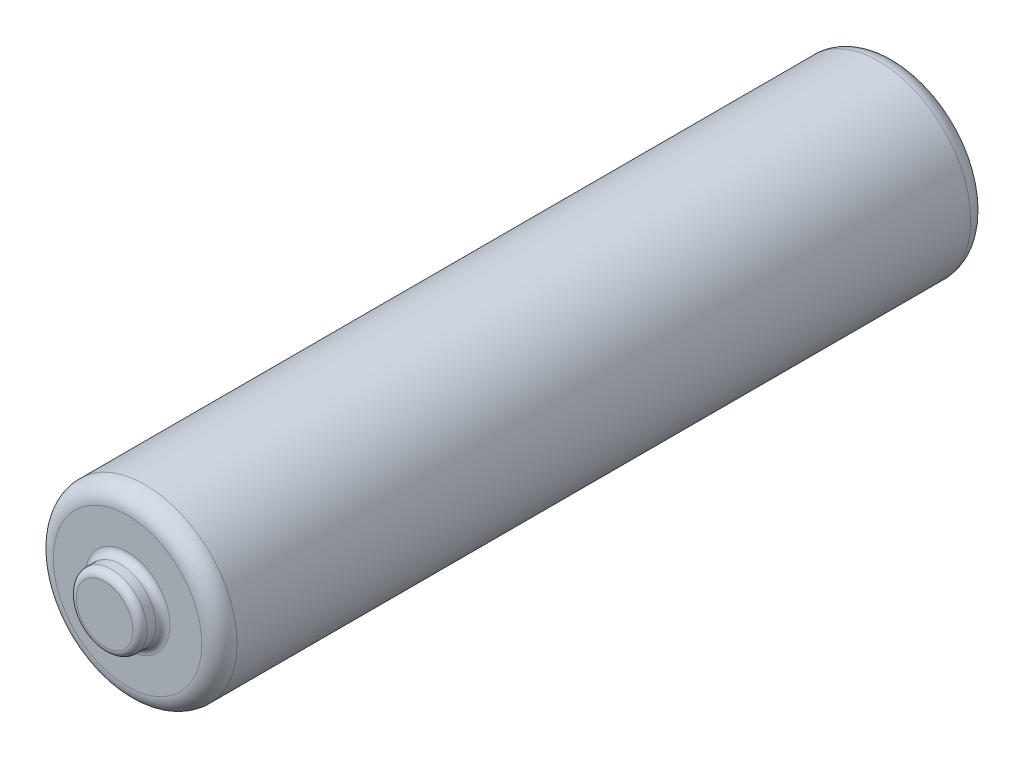
ISO-10303-21;
HEADER;
FILE_DESCRIPTION(('STEP AP214'),'2;1');
FILE_NAME('part.step','',(''),(''),'','','');
FILE_SCHEMA(('AUTOMOTIVE_DESIGN { 1 0 10303 214 1 1 1 1 }'));
ENDSEC;
DATA;
#1=APPLICATION_CONTEXT('core data for automotive mechanical design processes');
#2=APPLICATION_PROTOCOL_DEFINITION('international standard','automotive_design',2000,#1);
#3=PRODUCT_CONTEXT('',#1,'mechanical');
#4=PRODUCT('Part','Part','',(#3));
#5=PRODUCT_RELATED_PRODUCT_CATEGORY('part','',(#4));
#6=PRODUCT_DEFINITION_FORMATION('','',#4);
#7=PRODUCT_DEFINITION_CONTEXT('part definition',#1,'design');
#8=PRODUCT_DEFINITION('design','',#6,#7);
#9=PRODUCT_DEFINITION_SHAPE('','',#8);
#10=(LENGTH_UNIT() NAMED_UNIT(*) SI_UNIT(.MILLI.,.METRE.));
#11=(NAMED_UNIT(*) PLANE_ANGLE_UNIT() SI_UNIT($,.RADIAN.));
#12=(NAMED_UNIT(*) SI_UNIT($,.STERADIAN.) SOLID_ANGLE_UNIT());
#13=UNCERTAINTY_MEASURE_WITH_UNIT(LENGTH_MEASURE(1.E-05),#10,'distance_accuracy_value','');
#14=(GEOMETRIC_REPRESENTATION_CONTEXT(3) GLOBAL_UNCERTAINTY_ASSIGNED_CONTEXT((#13)) GLOBAL_UNIT_ASSIGNED_CONTEXT((#10,
#11,#12)) REPRESENTATION_CONTEXT('',''));
#15=CARTESIAN_POINT('',(0.,0.,0.));
#16=DIRECTION('',(0.,0.,1.));
#17=DIRECTION('',(1.,0.,0.));
#18=AXIS2_PLACEMENT_3D('',#15,#16,#17);
#19=CARTESIAN_POINT('',(0.,0.,43.5));
#20=DIRECTION('',(0.,0.,1.));
#21=DIRECTION('',(1.,0.,0.));
#22=AXIS2_PLACEMENT_3D('',#19,#20,#21);
#23=PLANE('',#22);
#24=CARTESIAN_POINT('',(0.,0.,43.5));
#25=DIRECTION('',(0.,0.,1.));
#26=DIRECTION('',(1.,0.,0.));
#27=AXIS2_PLACEMENT_3D('',#24,#25,#26);
#28=CIRCLE('',#27,2.4);
#29=CARTESIAN_POINT('',(2.4,0.,43.5));
#30=VERTEX_POINT('',#29);
#31=EDGE_CURVE('E10',#30,#30,#28,.F.);
#32=ORIENTED_EDGE('',*,*,#31,.T.);
#33=EDGE_LOOP('',(#32));
#34=FACE_BOUND('',#33,.T.);
#35=CARTESIAN_POINT('',(0.,0.,43.5));
#36=DIRECTION('',(0.,0.,1.));
#37=DIRECTION('',(1.,0.,0.));
#38=AXIS2_PLACEMENT_3D('',#35,#36,#37);
#39=CIRCLE('',#38,4.2);
#40=CARTESIAN_POINT('',(4.2,0.,43.5));
#41=VERTEX_POINT('',#40);
#42=EDGE_CURVE('E52',#41,#41,#39,.T.);
#43=ORIENTED_EDGE('',*,*,#42,.T.);
#44=EDGE_LOOP('',(#43));
#45=FACE_BOUND('',#44,.T.);
#46=ADVANCED_FACE('F32',(#34,#45),#23,.T.);
#47=CARTESIAN_POINT('',(0.,0.,43.5));
#48=DIRECTION('',(0.,0.,-1.));
#49=DIRECTION('',(-1.,0.,0.));
#50=AXIS2_PLACEMENT_3D('',#47,#48,#49);
#51=CYLINDRICAL_SURFACE('',#50,5.2);
#52=CARTESIAN_POINT('',(0.,0.,1.));
#53=DIRECTION('',(0.,0.,1.));
#54=DIRECTION('',(1.,0.,0.));
#55=AXIS2_PLACEMENT_3D('',#52,#53,#54);
#56=CIRCLE('',#55,5.2);
#57=CARTESIAN_POINT('',(5.2,0.,1.));
#58=VERTEX_POINT('',#57);
#59=EDGE_CURVE('E58',#58,#58,#56,.T.);
#60=ORIENTED_EDGE('',*,*,#59,.T.);
#61=EDGE_LOOP('',(#60));
#62=FACE_BOUND('',#61,.T.);
#63=CARTESIAN_POINT('',(0.,0.,42.5));
#64=DIRECTION('',(0.,0.,1.));
#65=DIRECTION('',(1.,0.,0.));
#66=AXIS2_PLACEMENT_3D('',#63,#64,#65);
#67=CIRCLE('',#66,5.2);
#68=CARTESIAN_POINT('',(5.2,0.,42.5));
#69=VERTEX_POINT('',#68);
#70=EDGE_CURVE('E61',#69,#69,#67,.F.);
#71=ORIENTED_EDGE('',*,*,#70,.T.);
#72=EDGE_LOOP('',(#71));
#73=FACE_BOUND('',#72,.T.);
#74=ADVANCED_FACE('F65',(#62,#73),#51,.T.);
#75=CARTESIAN_POINT('',(0.,0.,0.));
#76=DIRECTION('',(0.,0.,1.));
#77=DIRECTION('',(1.,0.,0.));
#78=AXIS2_PLACEMENT_3D('',#75,#76,#77);
#79=PLANE('',#78);
#80=CARTESIAN_POINT('',(0.,0.,0.));
#81=DIRECTION('',(0.,0.,1.));
#82=DIRECTION('',(1.,0.,0.));
#83=AXIS2_PLACEMENT_3D('',#80,#81,#82);
#84=CIRCLE('',#83,4.2);
#85=CARTESIAN_POINT('',(4.2,0.,0.));
#86=VERTEX_POINT('',#85);
#87=EDGE_CURVE('E55',#86,#86,#84,.F.);
#88=ORIENTED_EDGE('',*,*,#87,.T.);
#89=EDGE_LOOP('',(#88));
#90=FACE_BOUND('',#89,.T.);
#91=ADVANCED_FACE('F80',(#90),#79,.F.);
#92=CARTESIAN_POINT('',(0.,0.,44.8));
#93=DIRECTION('',(0.,0.,-1.));
#94=DIRECTION('',(-1.,0.,0.));
#95=AXIS2_PLACEMENT_3D('',#92,#93,#94);
#96=CYLINDRICAL_SURFACE('',#95,2.);
#97=CARTESIAN_POINT('',(0.,0.,44.4));
#98=DIRECTION('',(0.,0.,1.));
#99=DIRECTION('',(1.,0.,0.));
#100=AXIS2_PLACEMENT_3D('',#97,#98,#99);
#101=CIRCLE('',#100,2.);
#102=CARTESIAN_POINT('',(2.,0.,44.4));
#103=VERTEX_POINT('',#102);
#104=EDGE_CURVE('E39',#103,#103,#101,.F.);
#105=ORIENTED_EDGE('',*,*,#104,.T.);
#106=EDGE_LOOP('',(#105));
#107=FACE_BOUND('',#106,.T.);
#108=CARTESIAN_POINT('',(0.,0.,43.9));
#109=DIRECTION('',(0.,0.,1.));
#110=DIRECTION('',(1.,0.,0.));
#111=AXIS2_PLACEMENT_3D('',#108,#109,#110);
#112=CIRCLE('',#111,2.);
#113=CARTESIAN_POINT('',(2.,0.,43.9));
#114=VERTEX_POINT('',#113);
#115=EDGE_CURVE('E43',#114,#114,#112,.T.);
#116=ORIENTED_EDGE('',*,*,#115,.T.);
#117=EDGE_LOOP('',(#116));
#118=FACE_BOUND('',#117,.T.);
#119=ADVANCED_FACE('F85',(#107,#118),#96,.T.);
#120=CARTESIAN_POINT('',(0.,0.,44.8));
#121=DIRECTION('',(0.,0.,1.));
#122=DIRECTION('',(1.,0.,0.));
#123=AXIS2_PLACEMENT_3D('',#120,#121,#122);
#124=PLANE('',#123);
#125=CARTESIAN_POINT('',(0.,0.,44.8));
#126=DIRECTION('',(0.,0.,1.));
#127=DIRECTION('',(1.,0.,0.));
#128=AXIS2_PLACEMENT_3D('',#125,#126,#127);
#129=CIRCLE('',#128,1.6);
#130=CARTESIAN_POINT('',(1.6,0.,44.8));
#131=VERTEX_POINT('',#130);
#132=EDGE_CURVE('E47',#131,#131,#129,.T.);
#133=ORIENTED_EDGE('',*,*,#132,.T.);
#134=EDGE_LOOP('',(#133));
#135=FACE_BOUND('',#134,.T.);
#136=ADVANCED_FACE('F91',(#135),#124,.T.);
#137=CARTESIAN_POINT('',(0.,0.,1.));
#138=DIRECTION('',(0.,0.,1.));
#139=DIRECTION('',(1.,0.,0.));
#140=AXIS2_PLACEMENT_3D('',#137,#138,#139);
#141=TOROIDAL_SURFACE('',#140,4.2,1.);
#142=ORIENTED_EDGE('',*,*,#87,.F.);
#143=EDGE_LOOP('',(#142));
#144=FACE_BOUND('',#143,.T.);
#145=ORIENTED_EDGE('',*,*,#59,.F.);
#146=EDGE_LOOP('',(#145));
#147=FACE_BOUND('',#146,.T.);
#148=ADVANCED_FACE('F71',(#144,#147),#141,.T.);
#149=CARTESIAN_POINT('',(0.,0.,42.5));
#150=DIRECTION('',(0.,0.,1.));
#151=DIRECTION('',(1.,0.,0.));
#152=AXIS2_PLACEMENT_3D('',#149,#150,#151);
#153=TOROIDAL_SURFACE('',#152,4.2,1.);
#154=ORIENTED_EDGE('',*,*,#70,.F.);
#155=EDGE_LOOP('',(#154));
#156=FACE_BOUND('',#155,.T.);
#157=ORIENTED_EDGE('',*,*,#42,.F.);
#158=EDGE_LOOP('',(#157));
#159=FACE_BOUND('',#158,.T.);
#160=ADVANCED_FACE('F67',(#156,#159),#153,.T.);
#161=CARTESIAN_POINT('',(0.,0.,44.4));
#162=DIRECTION('',(0.,0.,1.));
#163=DIRECTION('',(1.,0.,0.));
#164=AXIS2_PLACEMENT_3D('',#161,#162,#163);
#165=TOROIDAL_SURFACE('',#164,1.6,0.4);
#166=ORIENTED_EDGE('',*,*,#104,.F.);
#167=EDGE_LOOP('',(#166));
#168=FACE_BOUND('',#167,.T.);
#169=ORIENTED_EDGE('',*,*,#132,.F.);
#170=EDGE_LOOP('',(#169));
#171=FACE_BOUND('',#170,.T.);
#172=ADVANCED_FACE('F70',(#168,#171),#165,.T.);
#173=CARTESIAN_POINT('',(0.,0.,43.9));
#174=DIRECTION('',(0.,0.,1.));
#175=DIRECTION('',(1.,0.,0.));
#176=AXIS2_PLACEMENT_3D('',#173,#174,#175);
#177=TOROIDAL_SURFACE('',#176,2.4,0.4);
#178=ORIENTED_EDGE('',*,*,#31,.F.);
#179=EDGE_LOOP('',(#178));
#180=FACE_BOUND('',#179,.T.);
#181=ORIENTED_EDGE('',*,*,#115,.F.);
#182=EDGE_LOOP('',(#181));
#183=FACE_BOUND('',#182,.T.);
#184=ADVANCED_FACE('F34',(#180,#183),#177,.F.);
#185=CLOSED_SHELL('',(#46,#74,#91,#119,#136,#148,#160,#172,#184));
#186=MANIFOLD_SOLID_BREP('B2',#185);
#187=ADVANCED_BREP_SHAPE_REPRESENTATION('',(#18,#186),#14);
#188=SHAPE_DEFINITION_REPRESENTATION(#9,#187);
ENDSEC;
END-ISO-10303-21;
